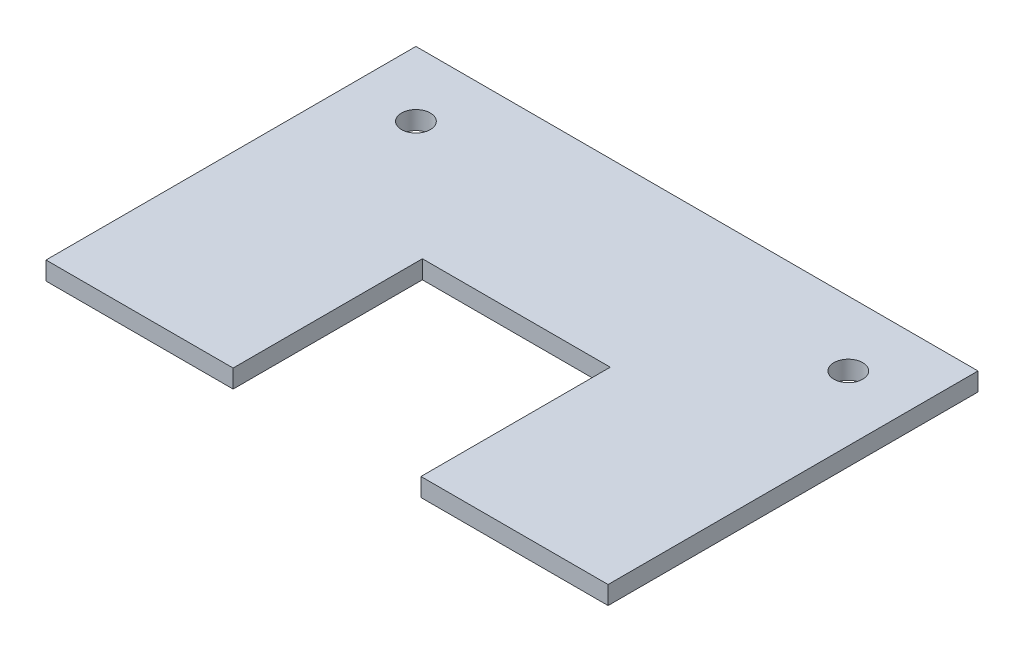
ISO-10303-21;
HEADER;
FILE_DESCRIPTION(('STEP AP214'),'2;1');
FILE_NAME('part.step','',(''),(''),'','','');
FILE_SCHEMA(('AUTOMOTIVE_DESIGN { 1 0 10303 214 1 1 1 1 }'));
ENDSEC;
DATA;
#1=APPLICATION_CONTEXT('core data for automotive mechanical design processes');
#2=APPLICATION_PROTOCOL_DEFINITION('international standard','automotive_design',2000,#1);
#3=PRODUCT_CONTEXT('',#1,'mechanical');
#4=PRODUCT('Part','Part','',(#3));
#5=PRODUCT_RELATED_PRODUCT_CATEGORY('part','',(#4));
#6=PRODUCT_DEFINITION_FORMATION('','',#4);
#7=PRODUCT_DEFINITION_CONTEXT('part definition',#1,'design');
#8=PRODUCT_DEFINITION('design','',#6,#7);
#9=PRODUCT_DEFINITION_SHAPE('','',#8);
#10=(LENGTH_UNIT() NAMED_UNIT(*) SI_UNIT(.MILLI.,.METRE.));
#11=(NAMED_UNIT(*) PLANE_ANGLE_UNIT() SI_UNIT($,.RADIAN.));
#12=(NAMED_UNIT(*) SI_UNIT($,.STERADIAN.) SOLID_ANGLE_UNIT());
#13=UNCERTAINTY_MEASURE_WITH_UNIT(LENGTH_MEASURE(1.E-05),#10,'distance_accuracy_value','');
#14=(GEOMETRIC_REPRESENTATION_CONTEXT(3) GLOBAL_UNCERTAINTY_ASSIGNED_CONTEXT((#13)) GLOBAL_UNIT_ASSIGNED_CONTEXT((#10,
#11,#12)) REPRESENTATION_CONTEXT('',''));
#15=CARTESIAN_POINT('',(0.,0.,0.));
#16=DIRECTION('',(0.,0.,1.));
#17=DIRECTION('',(1.,0.,0.));
#18=AXIS2_PLACEMENT_3D('',#15,#16,#17);
#19=CARTESIAN_POINT('',(0.,1.9,0.));
#20=DIRECTION('',(1.,0.,0.));
#21=DIRECTION('',(0.,0.,-1.));
#22=AXIS2_PLACEMENT_3D('',#19,#20,#21);
#23=PLANE('',#22);
#24=DIRECTION('',(0.,0.,1.));
#25=VECTOR('',#24,1.);
#26=CARTESIAN_POINT('',(0.,0.,0.));
#27=LINE('',#26,#25);
#28=CARTESIAN_POINT('',(0.,0.,0.));
#29=VERTEX_POINT('',#28);
#30=CARTESIAN_POINT('',(0.,0.,38.5));
#31=VERTEX_POINT('',#30);
#32=EDGE_CURVE('E139',#29,#31,#27,.T.);
#33=ORIENTED_EDGE('',*,*,#32,.T.);
#34=DIRECTION('',(0.,-1.,0.));
#35=VECTOR('',#34,1.);
#36=CARTESIAN_POINT('',(0.,1.9,38.5));
#37=LINE('',#36,#35);
#38=CARTESIAN_POINT('',(0.,1.9,38.5));
#39=VERTEX_POINT('',#38);
#40=EDGE_CURVE('E11',#39,#31,#37,.T.);
#41=ORIENTED_EDGE('',*,*,#40,.F.);
#42=DIRECTION('',(0.,0.,1.));
#43=VECTOR('',#42,1.);
#44=CARTESIAN_POINT('',(0.,1.9,0.));
#45=LINE('',#44,#43);
#46=CARTESIAN_POINT('',(0.,1.9,0.));
#47=VERTEX_POINT('',#46);
#48=EDGE_CURVE('E162',#47,#39,#45,.T.);
#49=ORIENTED_EDGE('',*,*,#48,.F.);
#50=DIRECTION('',(0.,-1.,0.));
#51=VECTOR('',#50,1.);
#52=CARTESIAN_POINT('',(0.,1.9,0.));
#53=LINE('',#52,#51);
#54=EDGE_CURVE('E135',#47,#29,#53,.T.);
#55=ORIENTED_EDGE('',*,*,#54,.T.);
#56=EDGE_LOOP('',(#33,#41,#49,#55));
#57=FACE_BOUND('',#56,.T.);
#58=ADVANCED_FACE('F38',(#57),#23,.F.);
#59=CARTESIAN_POINT('',(0.,1.9,38.5));
#60=DIRECTION('',(0.,0.,-1.));
#61=DIRECTION('',(-1.,0.,0.));
#62=AXIS2_PLACEMENT_3D('',#59,#60,#61);
#63=PLANE('',#62);
#64=DIRECTION('',(1.,0.,0.));
#65=VECTOR('',#64,1.);
#66=CARTESIAN_POINT('',(0.,0.,38.5));
#67=LINE('',#66,#65);
#68=CARTESIAN_POINT('',(19.475,0.,38.5));
#69=VERTEX_POINT('',#68);
#70=EDGE_CURVE('E143',#31,#69,#67,.T.);
#71=ORIENTED_EDGE('',*,*,#70,.T.);
#72=DIRECTION('',(0.,-1.,0.));
#73=VECTOR('',#72,1.);
#74=CARTESIAN_POINT('',(19.475,1.9,38.5));
#75=LINE('',#74,#73);
#76=CARTESIAN_POINT('',(19.475,1.9,38.5));
#77=VERTEX_POINT('',#76);
#78=EDGE_CURVE('E47',#77,#69,#75,.T.);
#79=ORIENTED_EDGE('',*,*,#78,.F.);
#80=DIRECTION('',(1.,0.,0.));
#81=VECTOR('',#80,1.);
#82=CARTESIAN_POINT('',(0.,1.9,38.5));
#83=LINE('',#82,#81);
#84=EDGE_CURVE('E98',#39,#77,#83,.T.);
#85=ORIENTED_EDGE('',*,*,#84,.F.);
#86=ORIENTED_EDGE('',*,*,#40,.T.);
#87=EDGE_LOOP('',(#71,#79,#85,#86));
#88=FACE_BOUND('',#87,.T.);
#89=ADVANCED_FACE('F242',(#88),#63,.F.);
#90=CARTESIAN_POINT('',(19.475,1.9,38.5));
#91=DIRECTION('',(-1.,0.,0.));
#92=DIRECTION('',(0.,0.,1.));
#93=AXIS2_PLACEMENT_3D('',#90,#91,#92);
#94=PLANE('',#93);
#95=DIRECTION('',(0.,0.,-1.));
#96=VECTOR('',#95,1.);
#97=CARTESIAN_POINT('',(19.475,0.,38.5));
#98=LINE('',#97,#96);
#99=CARTESIAN_POINT('',(19.475,0.,18.8));
#100=VERTEX_POINT('',#99);
#101=EDGE_CURVE('E147',#69,#100,#98,.T.);
#102=ORIENTED_EDGE('',*,*,#101,.T.);
#103=DIRECTION('',(0.,-1.,0.));
#104=VECTOR('',#103,1.);
#105=CARTESIAN_POINT('',(19.475,1.9,18.8));
#106=LINE('',#105,#104);
#107=CARTESIAN_POINT('',(19.475,1.9,18.8));
#108=VERTEX_POINT('',#107);
#109=EDGE_CURVE('E173',#108,#100,#106,.T.);
#110=ORIENTED_EDGE('',*,*,#109,.F.);
#111=DIRECTION('',(0.,0.,-1.));
#112=VECTOR('',#111,1.);
#113=CARTESIAN_POINT('',(19.475,1.9,38.5));
#114=LINE('',#113,#112);
#115=EDGE_CURVE('E183',#77,#108,#114,.T.);
#116=ORIENTED_EDGE('',*,*,#115,.F.);
#117=ORIENTED_EDGE('',*,*,#78,.T.);
#118=EDGE_LOOP('',(#102,#110,#116,#117));
#119=FACE_BOUND('',#118,.T.);
#120=ADVANCED_FACE('F181',(#119),#94,.F.);
#121=CARTESIAN_POINT('',(19.475,1.9,18.8));
#122=DIRECTION('',(0.,0.,-1.));
#123=DIRECTION('',(-1.,0.,0.));
#124=AXIS2_PLACEMENT_3D('',#121,#122,#123);
#125=PLANE('',#124);
#126=DIRECTION('',(1.,0.,0.));
#127=VECTOR('',#126,1.);
#128=CARTESIAN_POINT('',(19.475,0.,18.8));
#129=LINE('',#128,#127);
#130=CARTESIAN_POINT('',(39.025,0.,18.8));
#131=VERTEX_POINT('',#130);
#132=EDGE_CURVE('E150',#100,#131,#129,.T.);
#133=ORIENTED_EDGE('',*,*,#132,.T.);
#134=DIRECTION('',(0.,-1.,0.));
#135=VECTOR('',#134,1.);
#136=CARTESIAN_POINT('',(39.025,1.9,18.8));
#137=LINE('',#136,#135);
#138=CARTESIAN_POINT('',(39.025,1.9,18.8));
#139=VERTEX_POINT('',#138);
#140=EDGE_CURVE('E169',#139,#131,#137,.T.);
#141=ORIENTED_EDGE('',*,*,#140,.F.);
#142=DIRECTION('',(1.,0.,0.));
#143=VECTOR('',#142,1.);
#144=CARTESIAN_POINT('',(19.475,1.9,18.8));
#145=LINE('',#144,#143);
#146=EDGE_CURVE('E196',#108,#139,#145,.T.);
#147=ORIENTED_EDGE('',*,*,#146,.F.);
#148=ORIENTED_EDGE('',*,*,#109,.T.);
#149=EDGE_LOOP('',(#133,#141,#147,#148));
#150=FACE_BOUND('',#149,.T.);
#151=ADVANCED_FACE('F191',(#150),#125,.F.);
#152=CARTESIAN_POINT('',(39.025,1.9,38.5));
#153=DIRECTION('',(1.,0.,0.));
#154=DIRECTION('',(0.,0.,-1.));
#155=AXIS2_PLACEMENT_3D('',#152,#153,#154);
#156=PLANE('',#155);
#157=DIRECTION('',(0.,0.,1.));
#158=VECTOR('',#157,1.);
#159=CARTESIAN_POINT('',(39.025,0.,38.5));
#160=LINE('',#159,#158);
#161=CARTESIAN_POINT('',(39.025,0.,38.5));
#162=VERTEX_POINT('',#161);
#163=EDGE_CURVE('E153',#131,#162,#160,.T.);
#164=ORIENTED_EDGE('',*,*,#163,.T.);
#165=DIRECTION('',(0.,-1.,0.));
#166=VECTOR('',#165,1.);
#167=CARTESIAN_POINT('',(39.025,1.9,38.5));
#168=LINE('',#167,#166);
#169=CARTESIAN_POINT('',(39.025,1.9,38.5));
#170=VERTEX_POINT('',#169);
#171=EDGE_CURVE('E128',#170,#162,#168,.T.);
#172=ORIENTED_EDGE('',*,*,#171,.F.);
#173=DIRECTION('',(0.,0.,1.));
#174=VECTOR('',#173,1.);
#175=CARTESIAN_POINT('',(39.025,1.9,38.5));
#176=LINE('',#175,#174);
#177=EDGE_CURVE('E117',#139,#170,#176,.T.);
#178=ORIENTED_EDGE('',*,*,#177,.F.);
#179=ORIENTED_EDGE('',*,*,#140,.T.);
#180=EDGE_LOOP('',(#164,#172,#178,#179));
#181=FACE_BOUND('',#180,.T.);
#182=ADVANCED_FACE('F194',(#181),#156,.F.);
#183=CARTESIAN_POINT('',(39.025,1.9,38.5));
#184=DIRECTION('',(0.,0.,-1.));
#185=DIRECTION('',(-1.,0.,0.));
#186=AXIS2_PLACEMENT_3D('',#183,#184,#185);
#187=PLANE('',#186);
#188=DIRECTION('',(1.,0.,0.));
#189=VECTOR('',#188,1.);
#190=CARTESIAN_POINT('',(39.025,0.,38.5));
#191=LINE('',#190,#189);
#192=CARTESIAN_POINT('',(58.5,0.,38.5));
#193=VERTEX_POINT('',#192);
#194=EDGE_CURVE('E126',#162,#193,#191,.T.);
#195=ORIENTED_EDGE('',*,*,#194,.T.);
#196=DIRECTION('',(0.,-1.,0.));
#197=VECTOR('',#196,1.);
#198=CARTESIAN_POINT('',(58.5,1.9,38.5));
#199=LINE('',#198,#197);
#200=CARTESIAN_POINT('',(58.5,1.9,38.5));
#201=VERTEX_POINT('',#200);
#202=EDGE_CURVE('E123',#201,#193,#199,.T.);
#203=ORIENTED_EDGE('',*,*,#202,.F.);
#204=DIRECTION('',(1.,0.,0.));
#205=VECTOR('',#204,1.);
#206=CARTESIAN_POINT('',(39.025,1.9,38.5));
#207=LINE('',#206,#205);
#208=EDGE_CURVE('E111',#170,#201,#207,.T.);
#209=ORIENTED_EDGE('',*,*,#208,.F.);
#210=ORIENTED_EDGE('',*,*,#171,.T.);
#211=EDGE_LOOP('',(#195,#203,#209,#210));
#212=FACE_BOUND('',#211,.T.);
#213=ADVANCED_FACE('F124',(#212),#187,.F.);
#214=CARTESIAN_POINT('',(58.5,1.9,0.));
#215=DIRECTION('',(-1.,0.,0.));
#216=DIRECTION('',(0.,0.,1.));
#217=AXIS2_PLACEMENT_3D('',#214,#215,#216);
#218=PLANE('',#217);
#219=DIRECTION('',(0.,0.,-1.));
#220=VECTOR('',#219,1.);
#221=CARTESIAN_POINT('',(58.5,0.,0.));
#222=LINE('',#221,#220);
#223=CARTESIAN_POINT('',(58.5,0.,0.));
#224=VERTEX_POINT('',#223);
#225=EDGE_CURVE('E84',#193,#224,#222,.T.);
#226=ORIENTED_EDGE('',*,*,#225,.T.);
#227=DIRECTION('',(0.,-1.,0.));
#228=VECTOR('',#227,1.);
#229=CARTESIAN_POINT('',(58.5,1.9,0.));
#230=LINE('',#229,#228);
#231=CARTESIAN_POINT('',(58.5,1.9,0.));
#232=VERTEX_POINT('',#231);
#233=EDGE_CURVE('E129',#232,#224,#230,.T.);
#234=ORIENTED_EDGE('',*,*,#233,.F.);
#235=DIRECTION('',(0.,0.,-1.));
#236=VECTOR('',#235,1.);
#237=CARTESIAN_POINT('',(58.5,1.9,0.));
#238=LINE('',#237,#236);
#239=EDGE_CURVE('E115',#201,#232,#238,.T.);
#240=ORIENTED_EDGE('',*,*,#239,.F.);
#241=ORIENTED_EDGE('',*,*,#202,.T.);
#242=EDGE_LOOP('',(#226,#234,#240,#241));
#243=FACE_BOUND('',#242,.T.);
#244=ADVANCED_FACE('F131',(#243),#218,.F.);
#245=CARTESIAN_POINT('',(0.,1.9,0.));
#246=DIRECTION('',(0.,0.,1.));
#247=DIRECTION('',(1.,0.,0.));
#248=AXIS2_PLACEMENT_3D('',#245,#246,#247);
#249=PLANE('',#248);
#250=DIRECTION('',(-1.,0.,0.));
#251=VECTOR('',#250,1.);
#252=CARTESIAN_POINT('',(0.,0.,0.));
#253=LINE('',#252,#251);
#254=EDGE_CURVE('E90',#224,#29,#253,.T.);
#255=ORIENTED_EDGE('',*,*,#254,.T.);
#256=ORIENTED_EDGE('',*,*,#54,.F.);
#257=DIRECTION('',(-1.,0.,0.));
#258=VECTOR('',#257,1.);
#259=CARTESIAN_POINT('',(0.,1.9,0.));
#260=LINE('',#259,#258);
#261=EDGE_CURVE('E55',#232,#47,#260,.T.);
#262=ORIENTED_EDGE('',*,*,#261,.F.);
#263=ORIENTED_EDGE('',*,*,#233,.T.);
#264=EDGE_LOOP('',(#255,#256,#262,#263));
#265=FACE_BOUND('',#264,.T.);
#266=ADVANCED_FACE('F249',(#265),#249,.F.);
#267=CARTESIAN_POINT('',(0.,1.9,0.));
#268=DIRECTION('',(0.,1.,0.));
#269=DIRECTION('',(0.,0.,1.));
#270=AXIS2_PLACEMENT_3D('',#267,#268,#269);
#271=PLANE('',#270);
#272=CARTESIAN_POINT('',(51.75,1.9,6.75));
#273=DIRECTION('',(0.,1.,0.));
#274=DIRECTION('',(0.,0.,1.));
#275=AXIS2_PLACEMENT_3D('',#272,#273,#274);
#276=CIRCLE('',#275,1.5);
#277=CARTESIAN_POINT('',(51.75,1.9,8.25));
#278=VERTEX_POINT('',#277);
#279=EDGE_CURVE('E214',#278,#278,#276,.F.);
#280=ORIENTED_EDGE('',*,*,#279,.T.);
#281=EDGE_LOOP('',(#280));
#282=FACE_BOUND('',#281,.T.);
#283=CARTESIAN_POINT('',(6.75,1.9,6.75));
#284=DIRECTION('',(0.,1.,0.));
#285=DIRECTION('',(0.,0.,1.));
#286=AXIS2_PLACEMENT_3D('',#283,#284,#285);
#287=CIRCLE('',#286,1.5);
#288=CARTESIAN_POINT('',(6.75,1.9,8.25));
#289=VERTEX_POINT('',#288);
#290=EDGE_CURVE('E206',#289,#289,#287,.F.);
#291=ORIENTED_EDGE('',*,*,#290,.T.);
#292=EDGE_LOOP('',(#291));
#293=FACE_BOUND('',#292,.T.);
#294=ORIENTED_EDGE('',*,*,#48,.T.);
#295=ORIENTED_EDGE('',*,*,#84,.T.);
#296=ORIENTED_EDGE('',*,*,#115,.T.);
#297=ORIENTED_EDGE('',*,*,#146,.T.);
#298=ORIENTED_EDGE('',*,*,#177,.T.);
#299=ORIENTED_EDGE('',*,*,#208,.T.);
#300=ORIENTED_EDGE('',*,*,#239,.T.);
#301=ORIENTED_EDGE('',*,*,#261,.T.);
#302=EDGE_LOOP('',(#294,#295,#296,#297,#298,#299,#300,#301));
#303=FACE_BOUND('',#302,.T.);
#304=ADVANCED_FACE('F113',(#282,#293,#303),#271,.T.);
#305=CARTESIAN_POINT('',(0.,0.,0.));
#306=DIRECTION('',(0.,1.,0.));
#307=DIRECTION('',(0.,0.,1.));
#308=AXIS2_PLACEMENT_3D('',#305,#306,#307);
#309=PLANE('',#308);
#310=CARTESIAN_POINT('',(51.75,0.,6.75));
#311=DIRECTION('',(0.,-1.,0.));
#312=DIRECTION('',(0.,0.,-1.));
#313=AXIS2_PLACEMENT_3D('',#310,#311,#312);
#314=CIRCLE('',#313,1.5);
#315=CARTESIAN_POINT('',(51.75,0.,5.25));
#316=VERTEX_POINT('',#315);
#317=EDGE_CURVE('E144',#316,#316,#314,.T.);
#318=ORIENTED_EDGE('',*,*,#317,.F.);
#319=EDGE_LOOP('',(#318));
#320=FACE_BOUND('',#319,.T.);
#321=CARTESIAN_POINT('',(6.75,0.,6.75));
#322=DIRECTION('',(0.,-1.,0.));
#323=DIRECTION('',(0.,0.,-1.));
#324=AXIS2_PLACEMENT_3D('',#321,#322,#323);
#325=CIRCLE('',#324,1.5);
#326=CARTESIAN_POINT('',(6.75,0.,5.25));
#327=VERTEX_POINT('',#326);
#328=EDGE_CURVE('E210',#327,#327,#325,.T.);
#329=ORIENTED_EDGE('',*,*,#328,.F.);
#330=EDGE_LOOP('',(#329));
#331=FACE_BOUND('',#330,.T.);
#332=ORIENTED_EDGE('',*,*,#32,.F.);
#333=ORIENTED_EDGE('',*,*,#254,.F.);
#334=ORIENTED_EDGE('',*,*,#225,.F.);
#335=ORIENTED_EDGE('',*,*,#194,.F.);
#336=ORIENTED_EDGE('',*,*,#163,.F.);
#337=ORIENTED_EDGE('',*,*,#132,.F.);
#338=ORIENTED_EDGE('',*,*,#101,.F.);
#339=ORIENTED_EDGE('',*,*,#70,.F.);
#340=EDGE_LOOP('',(#332,#333,#334,#335,#336,#337,#338,#339));
#341=FACE_BOUND('',#340,.T.);
#342=ADVANCED_FACE('F187',(#320,#331,#341),#309,.F.);
#343=CARTESIAN_POINT('',(6.75,1.901,6.75));
#344=DIRECTION('',(0.,-1.,0.));
#345=DIRECTION('',(0.,0.,-1.));
#346=AXIS2_PLACEMENT_3D('',#343,#344,#345);
#347=CYLINDRICAL_SURFACE('',#346,1.5);
#348=ORIENTED_EDGE('',*,*,#290,.F.);
#349=EDGE_LOOP('',(#348));
#350=FACE_BOUND('',#349,.T.);
#351=ORIENTED_EDGE('',*,*,#328,.T.);
#352=EDGE_LOOP('',(#351));
#353=FACE_BOUND('',#352,.T.);
#354=ADVANCED_FACE('F226',(#350,#353),#347,.F.);
#355=CARTESIAN_POINT('',(51.75,1.901,6.75));
#356=DIRECTION('',(0.,-1.,0.));
#357=DIRECTION('',(0.,0.,-1.));
#358=AXIS2_PLACEMENT_3D('',#355,#356,#357);
#359=CYLINDRICAL_SURFACE('',#358,1.5);
#360=ORIENTED_EDGE('',*,*,#279,.F.);
#361=EDGE_LOOP('',(#360));
#362=FACE_BOUND('',#361,.T.);
#363=ORIENTED_EDGE('',*,*,#317,.T.);
#364=EDGE_LOOP('',(#363));
#365=FACE_BOUND('',#364,.T.);
#366=ADVANCED_FACE('F222',(#362,#365),#359,.F.);
#367=CLOSED_SHELL('',(#58,#89,#120,#151,#182,#213,#244,#266,#304,#342,#354,#366));
#368=MANIFOLD_SOLID_BREP('B2',#367);
#369=ADVANCED_BREP_SHAPE_REPRESENTATION('',(#18,#368),#14);
#370=SHAPE_DEFINITION_REPRESENTATION(#9,#369);
ENDSEC;
END-ISO-10303-21;
